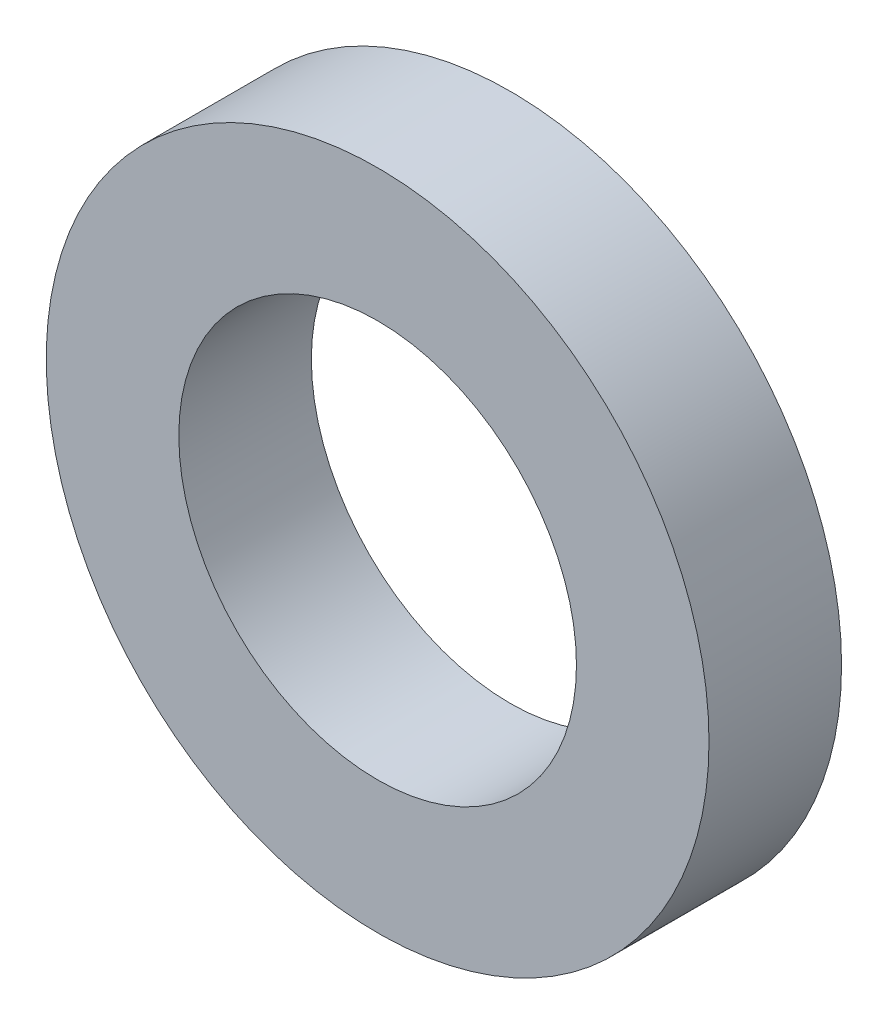
ISO-10303-21;
HEADER;
FILE_DESCRIPTION(('STEP AP214'),'2;1');
FILE_NAME('part.step','',(''),(''),'','','');
FILE_SCHEMA(('AUTOMOTIVE_DESIGN { 1 0 10303 214 1 1 1 1 }'));
ENDSEC;
DATA;
#1=APPLICATION_CONTEXT('core data for automotive mechanical design processes');
#2=APPLICATION_PROTOCOL_DEFINITION('international standard','automotive_design',2000,#1);
#3=PRODUCT_CONTEXT('',#1,'mechanical');
#4=PRODUCT('Part','Part','',(#3));
#5=PRODUCT_RELATED_PRODUCT_CATEGORY('part','',(#4));
#6=PRODUCT_DEFINITION_FORMATION('','',#4);
#7=PRODUCT_DEFINITION_CONTEXT('part definition',#1,'design');
#8=PRODUCT_DEFINITION('design','',#6,#7);
#9=PRODUCT_DEFINITION_SHAPE('','',#8);
#10=(LENGTH_UNIT() NAMED_UNIT(*) SI_UNIT(.MILLI.,.METRE.));
#11=(NAMED_UNIT(*) PLANE_ANGLE_UNIT() SI_UNIT($,.RADIAN.));
#12=(NAMED_UNIT(*) SI_UNIT($,.STERADIAN.) SOLID_ANGLE_UNIT());
#13=UNCERTAINTY_MEASURE_WITH_UNIT(LENGTH_MEASURE(1.E-05),#10,'distance_accuracy_value','');
#14=(GEOMETRIC_REPRESENTATION_CONTEXT(3) GLOBAL_UNCERTAINTY_ASSIGNED_CONTEXT((#13)) GLOBAL_UNIT_ASSIGNED_CONTEXT((#10,
#11,#12)) REPRESENTATION_CONTEXT('',''));
#15=CARTESIAN_POINT('',(0.,0.,0.));
#16=DIRECTION('',(0.,0.,1.));
#17=DIRECTION('',(1.,0.,0.));
#18=AXIS2_PLACEMENT_3D('',#15,#16,#17);
#19=CARTESIAN_POINT('',(0.,0.,1.));
#20=DIRECTION('',(0.,0.,1.));
#21=DIRECTION('',(1.,0.,0.));
#22=AXIS2_PLACEMENT_3D('',#19,#20,#21);
#23=PLANE('',#22);
#24=CARTESIAN_POINT('',(0.,0.,1.));
#25=DIRECTION('',(0.,0.,1.));
#26=DIRECTION('',(1.,0.,0.));
#27=AXIS2_PLACEMENT_3D('',#24,#25,#26);
#28=CIRCLE('',#27,2.5);
#29=CARTESIAN_POINT('',(2.5,0.,1.));
#30=VERTEX_POINT('',#29);
#31=EDGE_CURVE('E10',#30,#30,#28,.T.);
#32=ORIENTED_EDGE('',*,*,#31,.T.);
#33=EDGE_LOOP('',(#32));
#34=FACE_BOUND('',#33,.T.);
#35=CARTESIAN_POINT('',(0.,0.,1.));
#36=DIRECTION('',(0.,0.,1.));
#37=DIRECTION('',(1.,0.,0.));
#38=AXIS2_PLACEMENT_3D('',#35,#36,#37);
#39=CIRCLE('',#38,1.5);
#40=CARTESIAN_POINT('',(1.5,0.,1.));
#41=VERTEX_POINT('',#40);
#42=EDGE_CURVE('E39',#41,#41,#39,.T.);
#43=ORIENTED_EDGE('',*,*,#42,.F.);
#44=EDGE_LOOP('',(#43));
#45=FACE_BOUND('',#44,.T.);
#46=ADVANCED_FACE('F28',(#34,#45),#23,.T.);
#47=CARTESIAN_POINT('',(0.,0.,0.));
#48=DIRECTION('',(0.,0.,1.));
#49=DIRECTION('',(1.,0.,0.));
#50=AXIS2_PLACEMENT_3D('',#47,#48,#49);
#51=PLANE('',#50);
#52=CARTESIAN_POINT('',(0.,0.,0.));
#53=DIRECTION('',(0.,0.,1.));
#54=DIRECTION('',(1.,0.,0.));
#55=AXIS2_PLACEMENT_3D('',#52,#53,#54);
#56=CIRCLE('',#55,2.5);
#57=CARTESIAN_POINT('',(2.5,0.,0.));
#58=VERTEX_POINT('',#57);
#59=EDGE_CURVE('E35',#58,#58,#56,.T.);
#60=ORIENTED_EDGE('',*,*,#59,.F.);
#61=EDGE_LOOP('',(#60));
#62=FACE_BOUND('',#61,.T.);
#63=CARTESIAN_POINT('',(0.,0.,0.));
#64=DIRECTION('',(0.,0.,1.));
#65=DIRECTION('',(1.,0.,0.));
#66=AXIS2_PLACEMENT_3D('',#63,#64,#65);
#67=CIRCLE('',#66,1.5);
#68=CARTESIAN_POINT('',(1.5,0.,0.));
#69=VERTEX_POINT('',#68);
#70=EDGE_CURVE('E43',#69,#69,#67,.T.);
#71=ORIENTED_EDGE('',*,*,#70,.T.);
#72=EDGE_LOOP('',(#71));
#73=FACE_BOUND('',#72,.T.);
#74=ADVANCED_FACE('F49',(#62,#73),#51,.F.);
#75=CARTESIAN_POINT('',(0.,0.,1.));
#76=DIRECTION('',(0.,0.,-1.));
#77=DIRECTION('',(-1.,0.,0.));
#78=AXIS2_PLACEMENT_3D('',#75,#76,#77);
#79=CYLINDRICAL_SURFACE('',#78,2.5);
#80=ORIENTED_EDGE('',*,*,#31,.F.);
#81=EDGE_LOOP('',(#80));
#82=FACE_BOUND('',#81,.T.);
#83=ORIENTED_EDGE('',*,*,#59,.T.);
#84=EDGE_LOOP('',(#83));
#85=FACE_BOUND('',#84,.T.);
#86=ADVANCED_FACE('F30',(#82,#85),#79,.T.);
#87=CARTESIAN_POINT('',(0.,0.,1.));
#88=DIRECTION('',(0.,0.,-1.));
#89=DIRECTION('',(-1.,0.,0.));
#90=AXIS2_PLACEMENT_3D('',#87,#88,#89);
#91=CYLINDRICAL_SURFACE('',#90,1.5);
#92=ORIENTED_EDGE('',*,*,#42,.T.);
#93=EDGE_LOOP('',(#92));
#94=FACE_BOUND('',#93,.T.);
#95=ORIENTED_EDGE('',*,*,#70,.F.);
#96=EDGE_LOOP('',(#95));
#97=FACE_BOUND('',#96,.T.);
#98=ADVANCED_FACE('F51',(#94,#97),#91,.F.);
#99=CLOSED_SHELL('',(#46,#74,#86,#98));
#100=MANIFOLD_SOLID_BREP('B2',#99);
#101=ADVANCED_BREP_SHAPE_REPRESENTATION('',(#18,#100),#14);
#102=SHAPE_DEFINITION_REPRESENTATION(#9,#101);
ENDSEC;
END-ISO-10303-21;
